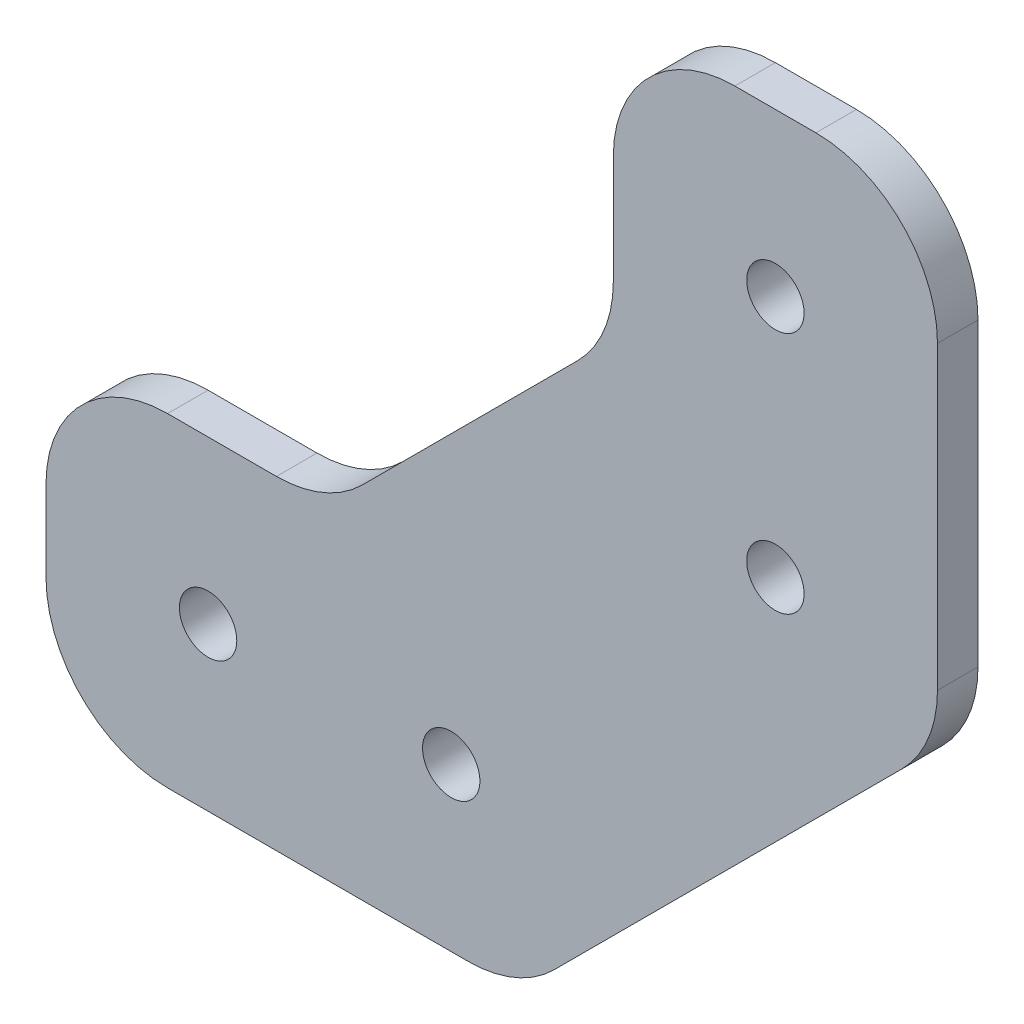
ISO-10303-21;
HEADER;
FILE_DESCRIPTION(('STEP AP214'),'2;1');
FILE_NAME('part.step','',(''),(''),'','','');
FILE_SCHEMA(('AUTOMOTIVE_DESIGN { 1 0 10303 214 1 1 1 1 }'));
ENDSEC;
DATA;
#1=APPLICATION_CONTEXT('core data for automotive mechanical design processes');
#2=APPLICATION_PROTOCOL_DEFINITION('international standard','automotive_design',2000,#1);
#3=PRODUCT_CONTEXT('',#1,'mechanical');
#4=PRODUCT('Part','Part','',(#3));
#5=PRODUCT_RELATED_PRODUCT_CATEGORY('part','',(#4));
#6=PRODUCT_DEFINITION_FORMATION('','',#4);
#7=PRODUCT_DEFINITION_CONTEXT('part definition',#1,'design');
#8=PRODUCT_DEFINITION('design','',#6,#7);
#9=PRODUCT_DEFINITION_SHAPE('','',#8);
#10=(LENGTH_UNIT() NAMED_UNIT(*) SI_UNIT(.MILLI.,.METRE.));
#11=(NAMED_UNIT(*) PLANE_ANGLE_UNIT() SI_UNIT($,.RADIAN.));
#12=(NAMED_UNIT(*) SI_UNIT($,.STERADIAN.) SOLID_ANGLE_UNIT());
#13=UNCERTAINTY_MEASURE_WITH_UNIT(LENGTH_MEASURE(1.E-05),#10,'distance_accuracy_value','');
#14=(GEOMETRIC_REPRESENTATION_CONTEXT(3) GLOBAL_UNCERTAINTY_ASSIGNED_CONTEXT((#13)) GLOBAL_UNIT_ASSIGNED_CONTEXT((#10,
#11,#12)) REPRESENTATION_CONTEXT('',''));
#15=CARTESIAN_POINT('',(0.,0.,0.));
#16=DIRECTION('',(0.,0.,1.));
#17=DIRECTION('',(1.,0.,0.));
#18=AXIS2_PLACEMENT_3D('',#15,#16,#17);
#19=CARTESIAN_POINT('',(69.85,32.8394877578617,1.5875));
#20=DIRECTION('',(-1.,0.,0.));
#21=DIRECTION('',(0.,0.,1.));
#22=AXIS2_PLACEMENT_3D('',#19,#20,#21);
#23=PLANE('',#22);
#24=DIRECTION('',(0.,1.,0.));
#25=VECTOR('',#24,1.);
#26=CARTESIAN_POINT('',(69.85,32.8394877578617,1.5875));
#27=LINE('',#26,#25);
#28=CARTESIAN_POINT('',(69.85,36.7848719394654,1.5875));
#29=VERTEX_POINT('',#28);
#30=CARTESIAN_POINT('',(69.85,60.325,1.5875));
#31=VERTEX_POINT('',#30);
#32=EDGE_CURVE('E166',#29,#31,#27,.T.);
#33=ORIENTED_EDGE('',*,*,#32,.F.);
#34=DIRECTION('',(0.,0.,-1.));
#35=VECTOR('',#34,1.);
#36=CARTESIAN_POINT('',(69.85,36.7848719394654,1.5875));
#37=LINE('',#36,#35);
#38=CARTESIAN_POINT('',(69.85,36.7848719394654,-1.5875));
#39=VERTEX_POINT('',#38);
#40=EDGE_CURVE('E151',#29,#39,#37,.T.);
#41=ORIENTED_EDGE('',*,*,#40,.T.);
#42=DIRECTION('',(0.,1.,0.));
#43=VECTOR('',#42,1.);
#44=CARTESIAN_POINT('',(69.85,32.8394877578617,-1.5875));
#45=LINE('',#44,#43);
#46=CARTESIAN_POINT('',(69.85,60.325,-1.5875));
#47=VERTEX_POINT('',#46);
#48=EDGE_CURVE('E163',#39,#47,#45,.T.);
#49=ORIENTED_EDGE('',*,*,#48,.T.);
#50=DIRECTION('',(0.,0.,-1.));
#51=VECTOR('',#50,1.);
#52=CARTESIAN_POINT('',(69.85,60.325,1.5875));
#53=LINE('',#52,#51);
#54=EDGE_CURVE('E168',#47,#31,#53,.F.);
#55=ORIENTED_EDGE('',*,*,#54,.T.);
#56=EDGE_LOOP('',(#33,#41,#49,#55));
#57=FACE_BOUND('',#56,.T.);
#58=ADVANCED_FACE('F33',(#57),#23,.F.);
#59=CARTESIAN_POINT('',(69.85,69.85,1.5875));
#60=DIRECTION('',(0.,-1.,0.));
#61=DIRECTION('',(0.,0.,-1.));
#62=AXIS2_PLACEMENT_3D('',#59,#60,#61);
#63=PLANE('',#62);
#64=DIRECTION('',(-1.,0.,0.));
#65=VECTOR('',#64,1.);
#66=CARTESIAN_POINT('',(69.85,69.85,1.5875));
#67=LINE('',#66,#65);
#68=CARTESIAN_POINT('',(60.325,69.85,1.5875));
#69=VERTEX_POINT('',#68);
#70=CARTESIAN_POINT('',(53.975,69.85,1.5875));
#71=VERTEX_POINT('',#70);
#72=EDGE_CURVE('E350',#69,#71,#67,.T.);
#73=ORIENTED_EDGE('',*,*,#72,.F.);
#74=DIRECTION('',(0.,0.,-1.));
#75=VECTOR('',#74,1.);
#76=CARTESIAN_POINT('',(60.325,69.85,1.5875));
#77=LINE('',#76,#75);
#78=CARTESIAN_POINT('',(60.325,69.85,-1.5875));
#79=VERTEX_POINT('',#78);
#80=EDGE_CURVE('E234',#69,#79,#77,.T.);
#81=ORIENTED_EDGE('',*,*,#80,.T.);
#82=DIRECTION('',(-1.,0.,0.));
#83=VECTOR('',#82,1.);
#84=CARTESIAN_POINT('',(69.85,69.85,-1.5875));
#85=LINE('',#84,#83);
#86=CARTESIAN_POINT('',(53.975,69.85,-1.5875));
#87=VERTEX_POINT('',#86);
#88=EDGE_CURVE('E173',#79,#87,#85,.T.);
#89=ORIENTED_EDGE('',*,*,#88,.T.);
#90=DIRECTION('',(0.,0.,-1.));
#91=VECTOR('',#90,1.);
#92=CARTESIAN_POINT('',(53.975,69.85,1.5875));
#93=LINE('',#92,#91);
#94=EDGE_CURVE('E232',#87,#71,#93,.F.);
#95=ORIENTED_EDGE('',*,*,#94,.T.);
#96=EDGE_LOOP('',(#73,#81,#89,#95));
#97=FACE_BOUND('',#96,.T.);
#98=ADVANCED_FACE('F314',(#97),#63,.F.);
#99=CARTESIAN_POINT('',(44.45,69.85,1.5875));
#100=DIRECTION('',(1.,0.,0.));
#101=DIRECTION('',(0.,1.,0.));
#102=AXIS2_PLACEMENT_3D('',#99,#100,#101);
#103=PLANE('',#102);
#104=DIRECTION('',(0.,-1.,0.));
#105=VECTOR('',#104,1.);
#106=CARTESIAN_POINT('',(44.45,69.85,1.5875));
#107=LINE('',#106,#105);
#108=CARTESIAN_POINT('',(44.45,60.325,1.5875));
#109=VERTEX_POINT('',#108);
#110=CARTESIAN_POINT('',(44.45,51.7960244842766,1.5875));
#111=VERTEX_POINT('',#110);
#112=EDGE_CURVE('E281',#109,#111,#107,.T.);
#113=ORIENTED_EDGE('',*,*,#112,.F.);
#114=DIRECTION('',(0.,0.,-1.));
#115=VECTOR('',#114,1.);
#116=CARTESIAN_POINT('',(44.45,60.325,1.5875));
#117=LINE('',#116,#115);
#118=CARTESIAN_POINT('',(44.45,60.325,-1.5875));
#119=VERTEX_POINT('',#118);
#120=EDGE_CURVE('E239',#109,#119,#117,.T.);
#121=ORIENTED_EDGE('',*,*,#120,.T.);
#122=DIRECTION('',(0.,-1.,0.));
#123=VECTOR('',#122,1.);
#124=CARTESIAN_POINT('',(44.45,69.85,-1.5875));
#125=LINE('',#124,#123);
#126=CARTESIAN_POINT('',(44.45,51.7960244842766,-1.5875));
#127=VERTEX_POINT('',#126);
#128=EDGE_CURVE('E177',#119,#127,#125,.T.);
#129=ORIENTED_EDGE('',*,*,#128,.T.);
#130=DIRECTION('',(0.,0.,-1.));
#131=VECTOR('',#130,1.);
#132=CARTESIAN_POINT('',(44.45,51.7960244842766,1.5875));
#133=LINE('',#132,#131);
#134=EDGE_CURVE('E237',#127,#111,#133,.F.);
#135=ORIENTED_EDGE('',*,*,#134,.T.);
#136=EDGE_LOOP('',(#113,#121,#129,#135));
#137=FACE_BOUND('',#136,.T.);
#138=ADVANCED_FACE('F319',(#137),#103,.F.);
#139=CARTESIAN_POINT('',(44.45,47.8506403026729,1.5875));
#140=DIRECTION('',(0.707106781186548,-0.707106781186547,0.));
#141=DIRECTION('',(0.707106781186547,0.707106781186548,0.));
#142=AXIS2_PLACEMENT_3D('',#139,#140,#141);
#143=PLANE('',#142);
#144=DIRECTION('',(-0.707106781186547,-0.707106781186548,0.));
#145=VECTOR('',#144,1.);
#146=CARTESIAN_POINT('',(44.45,47.8506403026729,1.5875));
#147=LINE('',#146,#145);
#148=CARTESIAN_POINT('',(41.6601920908018,45.0608323934748,1.5875));
#149=VERTEX_POINT('',#148);
#150=CARTESIAN_POINT('',(24.7891676065252,28.1898079091981,1.5875));
#151=VERTEX_POINT('',#150);
#152=EDGE_CURVE('E273',#149,#151,#147,.T.);
#153=ORIENTED_EDGE('',*,*,#152,.F.);
#154=DIRECTION('',(0.,0.,-1.));
#155=VECTOR('',#154,1.);
#156=CARTESIAN_POINT('',(41.6601920908018,45.0608323934748,-1.5875));
#157=LINE('',#156,#155);
#158=CARTESIAN_POINT('',(41.6601920908018,45.0608323934748,-1.5875));
#159=VERTEX_POINT('',#158);
#160=EDGE_CURVE('E244',#149,#159,#157,.T.);
#161=ORIENTED_EDGE('',*,*,#160,.T.);
#162=DIRECTION('',(-0.707106781186547,-0.707106781186548,0.));
#163=VECTOR('',#162,1.);
#164=CARTESIAN_POINT('',(44.45,47.8506403026729,-1.5875));
#165=LINE('',#164,#163);
#166=CARTESIAN_POINT('',(24.7891676065252,28.1898079091981,-1.5875));
#167=VERTEX_POINT('',#166);
#168=EDGE_CURVE('E188',#159,#167,#165,.T.);
#169=ORIENTED_EDGE('',*,*,#168,.T.);
#170=DIRECTION('',(0.,0.,-1.));
#171=VECTOR('',#170,1.);
#172=CARTESIAN_POINT('',(24.7891676065252,28.1898079091981,1.5875));
#173=LINE('',#172,#171);
#174=EDGE_CURVE('E242',#167,#151,#173,.F.);
#175=ORIENTED_EDGE('',*,*,#174,.T.);
#176=EDGE_LOOP('',(#153,#161,#169,#175));
#177=FACE_BOUND('',#176,.T.);
#178=ADVANCED_FACE('F262',(#177),#143,.F.);
#179=CARTESIAN_POINT('',(21.9993596973271,25.4,1.5875));
#180=DIRECTION('',(0.,-1.,0.));
#181=DIRECTION('',(0.,0.,-1.));
#182=AXIS2_PLACEMENT_3D('',#179,#180,#181);
#183=PLANE('',#182);
#184=DIRECTION('',(-1.,0.,0.));
#185=VECTOR('',#184,1.);
#186=CARTESIAN_POINT('',(21.9993596973271,25.4,1.5875));
#187=LINE('',#186,#185);
#188=CARTESIAN_POINT('',(18.0539755157234,25.4,1.5875));
#189=VERTEX_POINT('',#188);
#190=CARTESIAN_POINT('',(9.525,25.4,1.5875));
#191=VERTEX_POINT('',#190);
#192=EDGE_CURVE('E271',#189,#191,#187,.T.);
#193=ORIENTED_EDGE('',*,*,#192,.F.);
#194=DIRECTION('',(0.,0.,-1.));
#195=VECTOR('',#194,1.);
#196=CARTESIAN_POINT('',(18.0539755157234,25.4,-1.5875));
#197=LINE('',#196,#195);
#198=CARTESIAN_POINT('',(18.0539755157234,25.4,-1.5875));
#199=VERTEX_POINT('',#198);
#200=EDGE_CURVE('E249',#189,#199,#197,.T.);
#201=ORIENTED_EDGE('',*,*,#200,.T.);
#202=DIRECTION('',(-1.,0.,0.));
#203=VECTOR('',#202,1.);
#204=CARTESIAN_POINT('',(21.9993596973271,25.4,-1.5875));
#205=LINE('',#204,#203);
#206=CARTESIAN_POINT('',(9.525,25.4,-1.5875));
#207=VERTEX_POINT('',#206);
#208=EDGE_CURVE('E191',#199,#207,#205,.T.);
#209=ORIENTED_EDGE('',*,*,#208,.T.);
#210=DIRECTION('',(0.,0.,-1.));
#211=VECTOR('',#210,1.);
#212=CARTESIAN_POINT('',(9.525,25.4,1.5875));
#213=LINE('',#212,#211);
#214=EDGE_CURVE('E247',#207,#191,#213,.F.);
#215=ORIENTED_EDGE('',*,*,#214,.T.);
#216=EDGE_LOOP('',(#193,#201,#209,#215));
#217=FACE_BOUND('',#216,.T.);
#218=ADVANCED_FACE('F275',(#217),#183,.F.);
#219=CARTESIAN_POINT('',(0.,25.4,1.5875));
#220=DIRECTION('',(1.,0.,0.));
#221=DIRECTION('',(0.,1.,0.));
#222=AXIS2_PLACEMENT_3D('',#219,#220,#221);
#223=PLANE('',#222);
#224=DIRECTION('',(0.,-1.,0.));
#225=VECTOR('',#224,1.);
#226=CARTESIAN_POINT('',(0.,25.4,-1.5875));
#227=LINE('',#226,#225);
#228=CARTESIAN_POINT('',(0.,15.875,-1.5875));
#229=VERTEX_POINT('',#228);
#230=CARTESIAN_POINT('',(0.,9.525,-1.5875));
#231=VERTEX_POINT('',#230);
#232=EDGE_CURVE('E194',#229,#231,#227,.T.);
#233=ORIENTED_EDGE('',*,*,#232,.T.);
#234=DIRECTION('',(0.,0.,-1.));
#235=VECTOR('',#234,1.);
#236=CARTESIAN_POINT('',(0.,9.525,1.5875));
#237=LINE('',#236,#235);
#238=CARTESIAN_POINT('',(0.,9.525,1.5875));
#239=VERTEX_POINT('',#238);
#240=EDGE_CURVE('E230',#231,#239,#237,.F.);
#241=ORIENTED_EDGE('',*,*,#240,.T.);
#242=DIRECTION('',(0.,-1.,0.));
#243=VECTOR('',#242,1.);
#244=CARTESIAN_POINT('',(0.,25.4,1.5875));
#245=LINE('',#244,#243);
#246=CARTESIAN_POINT('',(0.,15.875,1.5875));
#247=VERTEX_POINT('',#246);
#248=EDGE_CURVE('E277',#247,#239,#245,.T.);
#249=ORIENTED_EDGE('',*,*,#248,.F.);
#250=DIRECTION('',(0.,0.,-1.));
#251=VECTOR('',#250,1.);
#252=CARTESIAN_POINT('',(0.,15.875,1.5875));
#253=LINE('',#252,#251);
#254=EDGE_CURVE('E227',#247,#229,#253,.T.);
#255=ORIENTED_EDGE('',*,*,#254,.T.);
#256=EDGE_LOOP('',(#233,#241,#249,#255));
#257=FACE_BOUND('',#256,.T.);
#258=ADVANCED_FACE('F299',(#257),#223,.F.);
#259=CARTESIAN_POINT('',(0.,0.,1.5875));
#260=DIRECTION('',(0.,1.,0.));
#261=DIRECTION('',(-1.,0.,0.));
#262=AXIS2_PLACEMENT_3D('',#259,#260,#261);
#263=PLANE('',#262);
#264=DIRECTION('',(1.,0.,0.));
#265=VECTOR('',#264,1.);
#266=CARTESIAN_POINT('',(0.,0.,-1.5875));
#267=LINE('',#266,#265);
#268=CARTESIAN_POINT('',(9.525,0.,-1.5875));
#269=VERTEX_POINT('',#268);
#270=CARTESIAN_POINT('',(33.0651280605346,0.,-1.5875));
#271=VERTEX_POINT('',#270);
#272=EDGE_CURVE('E197',#269,#271,#267,.T.);
#273=ORIENTED_EDGE('',*,*,#272,.T.);
#274=DIRECTION('',(0.,0.,-1.));
#275=VECTOR('',#274,1.);
#276=CARTESIAN_POINT('',(33.0651280605346,0.,1.5875));
#277=LINE('',#276,#275);
#278=CARTESIAN_POINT('',(33.0651280605346,0.,1.5875));
#279=VERTEX_POINT('',#278);
#280=EDGE_CURVE('E48',#271,#279,#277,.F.);
#281=ORIENTED_EDGE('',*,*,#280,.T.);
#282=DIRECTION('',(1.,0.,0.));
#283=VECTOR('',#282,1.);
#284=CARTESIAN_POINT('',(0.,0.,1.5875));
#285=LINE('',#284,#283);
#286=CARTESIAN_POINT('',(9.525,0.,1.5875));
#287=VERTEX_POINT('',#286);
#288=EDGE_CURVE('E279',#287,#279,#285,.T.);
#289=ORIENTED_EDGE('',*,*,#288,.F.);
#290=DIRECTION('',(0.,0.,-1.));
#291=VECTOR('',#290,1.);
#292=CARTESIAN_POINT('',(9.525,0.,1.5875));
#293=LINE('',#292,#291);
#294=EDGE_CURVE('E223',#287,#269,#293,.T.);
#295=ORIENTED_EDGE('',*,*,#294,.T.);
#296=EDGE_LOOP('',(#273,#281,#289,#295));
#297=FACE_BOUND('',#296,.T.);
#298=ADVANCED_FACE('F292',(#297),#263,.F.);
#299=CARTESIAN_POINT('',(37.0105122421383,0.,1.5875));
#300=DIRECTION('',(-0.707106781186548,0.707106781186548,0.));
#301=DIRECTION('',(-0.707106781186548,-0.707106781186548,0.));
#302=AXIS2_PLACEMENT_3D('',#299,#300,#301);
#303=PLANE('',#302);
#304=DIRECTION('',(0.707106781186547,0.707106781186547,0.));
#305=VECTOR('',#304,1.);
#306=CARTESIAN_POINT('',(37.0105122421383,0.,-1.5875));
#307=LINE('',#306,#305);
#308=CARTESIAN_POINT('',(39.8003201513365,2.78980790919814,-1.5875));
#309=VERTEX_POINT('',#308);
#310=CARTESIAN_POINT('',(67.0601920908019,30.0496798486636,-1.5875));
#311=VERTEX_POINT('',#310);
#312=EDGE_CURVE('E199',#309,#311,#307,.T.);
#313=ORIENTED_EDGE('',*,*,#312,.T.);
#314=DIRECTION('',(0.,0.,-1.));
#315=VECTOR('',#314,1.);
#316=CARTESIAN_POINT('',(67.0601920908019,30.0496798486636,1.5875));
#317=LINE('',#316,#315);
#318=CARTESIAN_POINT('',(67.0601920908019,30.0496798486636,1.5875));
#319=VERTEX_POINT('',#318);
#320=EDGE_CURVE('E152',#311,#319,#317,.F.);
#321=ORIENTED_EDGE('',*,*,#320,.T.);
#322=DIRECTION('',(0.707106781186547,0.707106781186547,0.));
#323=VECTOR('',#322,1.);
#324=CARTESIAN_POINT('',(37.0105122421383,0.,1.5875));
#325=LINE('',#324,#323);
#326=CARTESIAN_POINT('',(39.8003201513365,2.78980790919814,1.5875));
#327=VERTEX_POINT('',#326);
#328=EDGE_CURVE('E183',#327,#319,#325,.T.);
#329=ORIENTED_EDGE('',*,*,#328,.F.);
#330=DIRECTION('',(0.,0.,-1.));
#331=VECTOR('',#330,1.);
#332=CARTESIAN_POINT('',(39.8003201513365,2.78980790919814,1.5875));
#333=LINE('',#332,#331);
#334=EDGE_CURVE('E157',#327,#309,#333,.T.);
#335=ORIENTED_EDGE('',*,*,#334,.T.);
#336=EDGE_LOOP('',(#313,#321,#329,#335));
#337=FACE_BOUND('',#336,.T.);
#338=ADVANCED_FACE('F288',(#337),#303,.F.);
#339=CARTESIAN_POINT('',(0.,0.,1.5875));
#340=DIRECTION('',(0.,0.,1.));
#341=DIRECTION('',(1.,0.,0.));
#342=AXIS2_PLACEMENT_3D('',#339,#340,#341);
#343=PLANE('',#342);
#344=CARTESIAN_POINT('',(12.7,12.7,1.5875));
#345=DIRECTION('',(0.,0.,1.));
#346=DIRECTION('',(1.,0.,0.));
#347=AXIS2_PLACEMENT_3D('',#344,#345,#346);
#348=CIRCLE('',#347,2.24789999999999);
#349=CARTESIAN_POINT('',(14.9479,12.7,1.5875));
#350=VERTEX_POINT('',#349);
#351=EDGE_CURVE('E371',#350,#350,#348,.T.);
#352=ORIENTED_EDGE('',*,*,#351,.F.);
#353=EDGE_LOOP('',(#352));
#354=FACE_BOUND('',#353,.T.);
#355=CARTESIAN_POINT('',(31.75,12.7,1.5875));
#356=DIRECTION('',(0.,0.,1.));
#357=DIRECTION('',(1.,0.,0.));
#358=AXIS2_PLACEMENT_3D('',#355,#356,#357);
#359=CIRCLE('',#358,2.24789999999999);
#360=CARTESIAN_POINT('',(33.9979,12.7,1.5875));
#361=VERTEX_POINT('',#360);
#362=EDGE_CURVE('E365',#361,#361,#359,.T.);
#363=ORIENTED_EDGE('',*,*,#362,.F.);
#364=EDGE_LOOP('',(#363));
#365=FACE_BOUND('',#364,.T.);
#366=CARTESIAN_POINT('',(57.15,38.1,1.5875));
#367=DIRECTION('',(0.,0.,1.));
#368=DIRECTION('',(1.,0.,0.));
#369=AXIS2_PLACEMENT_3D('',#366,#367,#368);
#370=CIRCLE('',#369,2.24789999999998);
#371=CARTESIAN_POINT('',(59.3979,38.1,1.5875));
#372=VERTEX_POINT('',#371);
#373=EDGE_CURVE('E359',#372,#372,#370,.T.);
#374=ORIENTED_EDGE('',*,*,#373,.F.);
#375=EDGE_LOOP('',(#374));
#376=FACE_BOUND('',#375,.T.);
#377=CARTESIAN_POINT('',(57.15,57.15,1.5875));
#378=DIRECTION('',(0.,0.,1.));
#379=DIRECTION('',(1.,0.,0.));
#380=AXIS2_PLACEMENT_3D('',#377,#378,#379);
#381=CIRCLE('',#380,2.24789999999998);
#382=CARTESIAN_POINT('',(59.3979,57.15,1.5875));
#383=VERTEX_POINT('',#382);
#384=EDGE_CURVE('E180',#383,#383,#381,.T.);
#385=ORIENTED_EDGE('',*,*,#384,.F.);
#386=EDGE_LOOP('',(#385));
#387=FACE_BOUND('',#386,.T.);
#388=ORIENTED_EDGE('',*,*,#328,.T.);
#389=CARTESIAN_POINT('',(60.325,36.7848719394654,1.5875));
#390=DIRECTION('',(0.,0.,1.));
#391=DIRECTION('',(1.,0.,0.));
#392=AXIS2_PLACEMENT_3D('',#389,#390,#391);
#393=CIRCLE('',#392,9.525);
#394=EDGE_CURVE('E221',#319,#29,#393,.T.);
#395=ORIENTED_EDGE('',*,*,#394,.T.);
#396=ORIENTED_EDGE('',*,*,#32,.T.);
#397=CARTESIAN_POINT('',(60.325,60.325,1.5875));
#398=DIRECTION('',(0.,0.,1.));
#399=DIRECTION('',(1.,0.,0.));
#400=AXIS2_PLACEMENT_3D('',#397,#398,#399);
#401=CIRCLE('',#400,9.525);
#402=EDGE_CURVE('E216',#31,#69,#401,.T.);
#403=ORIENTED_EDGE('',*,*,#402,.T.);
#404=ORIENTED_EDGE('',*,*,#72,.T.);
#405=CARTESIAN_POINT('',(53.975,60.325,1.5875));
#406=DIRECTION('',(0.,0.,1.));
#407=DIRECTION('',(1.,0.,0.));
#408=AXIS2_PLACEMENT_3D('',#405,#406,#407);
#409=CIRCLE('',#408,9.525);
#410=EDGE_CURVE('E214',#71,#109,#409,.T.);
#411=ORIENTED_EDGE('',*,*,#410,.T.);
#412=ORIENTED_EDGE('',*,*,#112,.T.);
#413=CARTESIAN_POINT('',(34.925,51.7960244842766,1.5875));
#414=DIRECTION('',(0.,0.,1.));
#415=DIRECTION('',(1.,0.,0.));
#416=AXIS2_PLACEMENT_3D('',#413,#414,#415);
#417=CIRCLE('',#416,9.525);
#418=EDGE_CURVE('E254',#111,#149,#417,.F.);
#419=ORIENTED_EDGE('',*,*,#418,.T.);
#420=ORIENTED_EDGE('',*,*,#152,.T.);
#421=CARTESIAN_POINT('',(18.0539755157234,34.925,1.5875));
#422=DIRECTION('',(0.,0.,1.));
#423=DIRECTION('',(1.,0.,0.));
#424=AXIS2_PLACEMENT_3D('',#421,#422,#423);
#425=CIRCLE('',#424,9.525);
#426=EDGE_CURVE('E11',#151,#189,#425,.F.);
#427=ORIENTED_EDGE('',*,*,#426,.T.);
#428=ORIENTED_EDGE('',*,*,#192,.T.);
#429=CARTESIAN_POINT('',(9.525,15.875,1.5875));
#430=DIRECTION('',(0.,0.,1.));
#431=DIRECTION('',(1.,0.,0.));
#432=AXIS2_PLACEMENT_3D('',#429,#430,#431);
#433=CIRCLE('',#432,9.525);
#434=EDGE_CURVE('E212',#191,#247,#433,.T.);
#435=ORIENTED_EDGE('',*,*,#434,.T.);
#436=ORIENTED_EDGE('',*,*,#248,.T.);
#437=CARTESIAN_POINT('',(9.525,9.525,1.5875));
#438=DIRECTION('',(0.,0.,1.));
#439=DIRECTION('',(1.,0.,0.));
#440=AXIS2_PLACEMENT_3D('',#437,#438,#439);
#441=CIRCLE('',#440,9.525);
#442=EDGE_CURVE('E55',#239,#287,#441,.T.);
#443=ORIENTED_EDGE('',*,*,#442,.T.);
#444=ORIENTED_EDGE('',*,*,#288,.T.);
#445=CARTESIAN_POINT('',(33.0651280605346,9.52500000000001,1.5875));
#446=DIRECTION('',(0.,0.,1.));
#447=DIRECTION('',(1.,0.,0.));
#448=AXIS2_PLACEMENT_3D('',#445,#446,#447);
#449=CIRCLE('',#448,9.525);
#450=EDGE_CURVE('E219',#279,#327,#449,.T.);
#451=ORIENTED_EDGE('',*,*,#450,.T.);
#452=EDGE_LOOP('',(#388,#395,#396,#403,#404,#411,#412,#419,#420,#427,#428,#435,#436,#443,#444,#451));
#453=FACE_BOUND('',#452,.T.);
#454=ADVANCED_FACE('F270',(#354,#365,#376,#387,#453),#343,.T.);
#455=CARTESIAN_POINT('',(0.,0.,-1.5875));
#456=DIRECTION('',(0.,0.,1.));
#457=DIRECTION('',(1.,0.,0.));
#458=AXIS2_PLACEMENT_3D('',#455,#456,#457);
#459=PLANE('',#458);
#460=CARTESIAN_POINT('',(12.7,12.7,-1.5875));
#461=DIRECTION('',(0.,0.,1.));
#462=DIRECTION('',(1.,0.,0.));
#463=AXIS2_PLACEMENT_3D('',#460,#461,#462);
#464=CIRCLE('',#463,2.2479);
#465=CARTESIAN_POINT('',(14.9479,12.7,-1.5875));
#466=VERTEX_POINT('',#465);
#467=EDGE_CURVE('E368',#466,#466,#464,.T.);
#468=ORIENTED_EDGE('',*,*,#467,.T.);
#469=EDGE_LOOP('',(#468));
#470=FACE_BOUND('',#469,.T.);
#471=CARTESIAN_POINT('',(31.75,12.7,-1.5875));
#472=DIRECTION('',(0.,0.,1.));
#473=DIRECTION('',(1.,0.,0.));
#474=AXIS2_PLACEMENT_3D('',#471,#472,#473);
#475=CIRCLE('',#474,2.2479);
#476=CARTESIAN_POINT('',(33.9979,12.7,-1.5875));
#477=VERTEX_POINT('',#476);
#478=EDGE_CURVE('E362',#477,#477,#475,.T.);
#479=ORIENTED_EDGE('',*,*,#478,.T.);
#480=EDGE_LOOP('',(#479));
#481=FACE_BOUND('',#480,.T.);
#482=CARTESIAN_POINT('',(57.15,38.1,-1.5875));
#483=DIRECTION('',(0.,0.,1.));
#484=DIRECTION('',(1.,0.,0.));
#485=AXIS2_PLACEMENT_3D('',#482,#483,#484);
#486=CIRCLE('',#485,2.2479);
#487=CARTESIAN_POINT('',(59.3979,38.1,-1.5875));
#488=VERTEX_POINT('',#487);
#489=EDGE_CURVE('E356',#488,#488,#486,.T.);
#490=ORIENTED_EDGE('',*,*,#489,.T.);
#491=EDGE_LOOP('',(#490));
#492=FACE_BOUND('',#491,.T.);
#493=CARTESIAN_POINT('',(57.15,57.15,-1.5875));
#494=DIRECTION('',(0.,0.,1.));
#495=DIRECTION('',(1.,0.,0.));
#496=AXIS2_PLACEMENT_3D('',#493,#494,#495);
#497=CIRCLE('',#496,2.2479);
#498=CARTESIAN_POINT('',(59.3979,57.15,-1.5875));
#499=VERTEX_POINT('',#498);
#500=EDGE_CURVE('E174',#499,#499,#497,.T.);
#501=ORIENTED_EDGE('',*,*,#500,.T.);
#502=EDGE_LOOP('',(#501));
#503=FACE_BOUND('',#502,.T.);
#504=ORIENTED_EDGE('',*,*,#48,.F.);
#505=CARTESIAN_POINT('',(60.325,36.7848719394654,-1.5875));
#506=DIRECTION('',(0.,0.,1.));
#507=DIRECTION('',(1.,0.,0.));
#508=AXIS2_PLACEMENT_3D('',#505,#506,#507);
#509=CIRCLE('',#508,9.525);
#510=EDGE_CURVE('E147',#39,#311,#509,.F.);
#511=ORIENTED_EDGE('',*,*,#510,.T.);
#512=ORIENTED_EDGE('',*,*,#312,.F.);
#513=CARTESIAN_POINT('',(33.0651280605346,9.52500000000001,-1.5875));
#514=DIRECTION('',(0.,0.,1.));
#515=DIRECTION('',(1.,0.,0.));
#516=AXIS2_PLACEMENT_3D('',#513,#514,#515);
#517=CIRCLE('',#516,9.525);
#518=EDGE_CURVE('E158',#309,#271,#517,.F.);
#519=ORIENTED_EDGE('',*,*,#518,.T.);
#520=ORIENTED_EDGE('',*,*,#272,.F.);
#521=CARTESIAN_POINT('',(9.525,9.525,-1.5875));
#522=DIRECTION('',(0.,0.,1.));
#523=DIRECTION('',(1.,0.,0.));
#524=AXIS2_PLACEMENT_3D('',#521,#522,#523);
#525=CIRCLE('',#524,9.525);
#526=EDGE_CURVE('E206',#269,#231,#525,.F.);
#527=ORIENTED_EDGE('',*,*,#526,.T.);
#528=ORIENTED_EDGE('',*,*,#232,.F.);
#529=CARTESIAN_POINT('',(9.525,15.875,-1.5875));
#530=DIRECTION('',(0.,0.,1.));
#531=DIRECTION('',(1.,0.,0.));
#532=AXIS2_PLACEMENT_3D('',#529,#530,#531);
#533=CIRCLE('',#532,9.525);
#534=EDGE_CURVE('E167',#229,#207,#533,.F.);
#535=ORIENTED_EDGE('',*,*,#534,.T.);
#536=ORIENTED_EDGE('',*,*,#208,.F.);
#537=CARTESIAN_POINT('',(18.0539755157234,34.925,-1.5875));
#538=DIRECTION('',(0.,0.,1.));
#539=DIRECTION('',(1.,0.,0.));
#540=AXIS2_PLACEMENT_3D('',#537,#538,#539);
#541=CIRCLE('',#540,9.525);
#542=EDGE_CURVE('E41',#199,#167,#541,.T.);
#543=ORIENTED_EDGE('',*,*,#542,.T.);
#544=ORIENTED_EDGE('',*,*,#168,.F.);
#545=CARTESIAN_POINT('',(34.925,51.7960244842766,-1.5875));
#546=DIRECTION('',(0.,0.,1.));
#547=DIRECTION('',(1.,0.,0.));
#548=AXIS2_PLACEMENT_3D('',#545,#546,#547);
#549=CIRCLE('',#548,9.525);
#550=EDGE_CURVE('E252',#159,#127,#549,.T.);
#551=ORIENTED_EDGE('',*,*,#550,.T.);
#552=ORIENTED_EDGE('',*,*,#128,.F.);
#553=CARTESIAN_POINT('',(53.975,60.325,-1.5875));
#554=DIRECTION('',(0.,0.,1.));
#555=DIRECTION('',(1.,0.,0.));
#556=AXIS2_PLACEMENT_3D('',#553,#554,#555);
#557=CIRCLE('',#556,9.525);
#558=EDGE_CURVE('E203',#119,#87,#557,.F.);
#559=ORIENTED_EDGE('',*,*,#558,.T.);
#560=ORIENTED_EDGE('',*,*,#88,.F.);
#561=CARTESIAN_POINT('',(60.325,60.325,-1.5875));
#562=DIRECTION('',(0.,0.,1.));
#563=DIRECTION('',(1.,0.,0.));
#564=AXIS2_PLACEMENT_3D('',#561,#562,#563);
#565=CIRCLE('',#564,9.525);
#566=EDGE_CURVE('E172',#79,#47,#565,.F.);
#567=ORIENTED_EDGE('',*,*,#566,.T.);
#568=EDGE_LOOP('',(#504,#511,#512,#519,#520,#527,#528,#535,#536,#543,#544,#551,#552,#559,#560,#567));
#569=FACE_BOUND('',#568,.T.);
#570=ADVANCED_FACE('F170',(#470,#481,#492,#503,#569),#459,.F.);
#571=CARTESIAN_POINT('',(60.325,36.7848719394654,1.5875));
#572=DIRECTION('',(0.,0.,-1.));
#573=DIRECTION('',(-1.,0.,0.));
#574=AXIS2_PLACEMENT_3D('',#571,#572,#573);
#575=CYLINDRICAL_SURFACE('',#574,9.525);
#576=ORIENTED_EDGE('',*,*,#394,.F.);
#577=ORIENTED_EDGE('',*,*,#320,.F.);
#578=ORIENTED_EDGE('',*,*,#510,.F.);
#579=ORIENTED_EDGE('',*,*,#40,.F.);
#580=EDGE_LOOP('',(#576,#577,#578,#579));
#581=FACE_BOUND('',#580,.T.);
#582=ADVANCED_FACE('F150',(#581),#575,.T.);
#583=CARTESIAN_POINT('',(33.0651280605346,9.52500000000001,1.5875));
#584=DIRECTION('',(0.,0.,-1.));
#585=DIRECTION('',(-1.,0.,0.));
#586=AXIS2_PLACEMENT_3D('',#583,#584,#585);
#587=CYLINDRICAL_SURFACE('',#586,9.525);
#588=ORIENTED_EDGE('',*,*,#450,.F.);
#589=ORIENTED_EDGE('',*,*,#280,.F.);
#590=ORIENTED_EDGE('',*,*,#518,.F.);
#591=ORIENTED_EDGE('',*,*,#334,.F.);
#592=EDGE_LOOP('',(#588,#589,#590,#591));
#593=FACE_BOUND('',#592,.T.);
#594=ADVANCED_FACE('F290',(#593),#587,.T.);
#595=CARTESIAN_POINT('',(9.525,9.525,1.5875));
#596=DIRECTION('',(0.,0.,-1.));
#597=DIRECTION('',(-1.,0.,0.));
#598=AXIS2_PLACEMENT_3D('',#595,#596,#597);
#599=CYLINDRICAL_SURFACE('',#598,9.525);
#600=ORIENTED_EDGE('',*,*,#442,.F.);
#601=ORIENTED_EDGE('',*,*,#240,.F.);
#602=ORIENTED_EDGE('',*,*,#526,.F.);
#603=ORIENTED_EDGE('',*,*,#294,.F.);
#604=EDGE_LOOP('',(#600,#601,#602,#603));
#605=FACE_BOUND('',#604,.T.);
#606=ADVANCED_FACE('F295',(#605),#599,.T.);
#607=CARTESIAN_POINT('',(60.325,60.325,1.5875));
#608=DIRECTION('',(0.,0.,-1.));
#609=DIRECTION('',(-1.,0.,0.));
#610=AXIS2_PLACEMENT_3D('',#607,#608,#609);
#611=CYLINDRICAL_SURFACE('',#610,9.525);
#612=ORIENTED_EDGE('',*,*,#402,.F.);
#613=ORIENTED_EDGE('',*,*,#54,.F.);
#614=ORIENTED_EDGE('',*,*,#566,.F.);
#615=ORIENTED_EDGE('',*,*,#80,.F.);
#616=EDGE_LOOP('',(#612,#613,#614,#615));
#617=FACE_BOUND('',#616,.T.);
#618=ADVANCED_FACE('F330',(#617),#611,.T.);
#619=CARTESIAN_POINT('',(53.975,60.325,1.5875));
#620=DIRECTION('',(0.,0.,-1.));
#621=DIRECTION('',(-1.,0.,0.));
#622=AXIS2_PLACEMENT_3D('',#619,#620,#621);
#623=CYLINDRICAL_SURFACE('',#622,9.525);
#624=ORIENTED_EDGE('',*,*,#410,.F.);
#625=ORIENTED_EDGE('',*,*,#94,.F.);
#626=ORIENTED_EDGE('',*,*,#558,.F.);
#627=ORIENTED_EDGE('',*,*,#120,.F.);
#628=EDGE_LOOP('',(#624,#625,#626,#627));
#629=FACE_BOUND('',#628,.T.);
#630=ADVANCED_FACE('F333',(#629),#623,.T.);
#631=CARTESIAN_POINT('',(34.925,51.7960244842766,1.5875));
#632=DIRECTION('',(0.,0.,1.));
#633=DIRECTION('',(1.,0.,0.));
#634=AXIS2_PLACEMENT_3D('',#631,#632,#633);
#635=CYLINDRICAL_SURFACE('',#634,9.525);
#636=ORIENTED_EDGE('',*,*,#418,.F.);
#637=ORIENTED_EDGE('',*,*,#134,.F.);
#638=ORIENTED_EDGE('',*,*,#550,.F.);
#639=ORIENTED_EDGE('',*,*,#160,.F.);
#640=EDGE_LOOP('',(#636,#637,#638,#639));
#641=FACE_BOUND('',#640,.T.);
#642=ADVANCED_FACE('F312',(#641),#635,.F.);
#643=CARTESIAN_POINT('',(18.0539755157234,34.925,1.5875));
#644=DIRECTION('',(0.,0.,1.));
#645=DIRECTION('',(1.,0.,0.));
#646=AXIS2_PLACEMENT_3D('',#643,#644,#645);
#647=CYLINDRICAL_SURFACE('',#646,9.525);
#648=ORIENTED_EDGE('',*,*,#426,.F.);
#649=ORIENTED_EDGE('',*,*,#174,.F.);
#650=ORIENTED_EDGE('',*,*,#542,.F.);
#651=ORIENTED_EDGE('',*,*,#200,.F.);
#652=EDGE_LOOP('',(#648,#649,#650,#651));
#653=FACE_BOUND('',#652,.T.);
#654=ADVANCED_FACE('F266',(#653),#647,.F.);
#655=CARTESIAN_POINT('',(9.525,15.875,1.5875));
#656=DIRECTION('',(0.,0.,-1.));
#657=DIRECTION('',(-1.,0.,0.));
#658=AXIS2_PLACEMENT_3D('',#655,#656,#657);
#659=CYLINDRICAL_SURFACE('',#658,9.525);
#660=ORIENTED_EDGE('',*,*,#434,.F.);
#661=ORIENTED_EDGE('',*,*,#214,.F.);
#662=ORIENTED_EDGE('',*,*,#534,.F.);
#663=ORIENTED_EDGE('',*,*,#254,.F.);
#664=EDGE_LOOP('',(#660,#661,#662,#663));
#665=FACE_BOUND('',#664,.T.);
#666=ADVANCED_FACE('F35',(#665),#659,.T.);
#667=CARTESIAN_POINT('',(57.15,57.15,1.5875));
#668=DIRECTION('',(0.,0.,1.));
#669=DIRECTION('',(1.,0.,0.));
#670=AXIS2_PLACEMENT_3D('',#667,#668,#669);
#671=CYLINDRICAL_SURFACE('',#670,2.24789999999999);
#672=ORIENTED_EDGE('',*,*,#500,.F.);
#673=EDGE_LOOP('',(#672));
#674=FACE_BOUND('',#673,.T.);
#675=ORIENTED_EDGE('',*,*,#384,.T.);
#676=EDGE_LOOP('',(#675));
#677=FACE_BOUND('',#676,.T.);
#678=ADVANCED_FACE('F304',(#674,#677),#671,.F.);
#679=CARTESIAN_POINT('',(57.15,38.1,1.5875));
#680=DIRECTION('',(0.,0.,1.));
#681=DIRECTION('',(1.,0.,0.));
#682=AXIS2_PLACEMENT_3D('',#679,#680,#681);
#683=CYLINDRICAL_SURFACE('',#682,2.24789999999999);
#684=ORIENTED_EDGE('',*,*,#489,.F.);
#685=EDGE_LOOP('',(#684));
#686=FACE_BOUND('',#685,.T.);
#687=ORIENTED_EDGE('',*,*,#373,.T.);
#688=EDGE_LOOP('',(#687));
#689=FACE_BOUND('',#688,.T.);
#690=ADVANCED_FACE('F309',(#686,#689),#683,.F.);
#691=CARTESIAN_POINT('',(31.75,12.7,1.5875));
#692=DIRECTION('',(0.,0.,1.));
#693=DIRECTION('',(1.,0.,0.));
#694=AXIS2_PLACEMENT_3D('',#691,#692,#693);
#695=CYLINDRICAL_SURFACE('',#694,2.24789999999999);
#696=ORIENTED_EDGE('',*,*,#478,.F.);
#697=EDGE_LOOP('',(#696));
#698=FACE_BOUND('',#697,.T.);
#699=ORIENTED_EDGE('',*,*,#362,.T.);
#700=EDGE_LOOP('',(#699));
#701=FACE_BOUND('',#700,.T.);
#702=ADVANCED_FACE('F388',(#698,#701),#695,.F.);
#703=CARTESIAN_POINT('',(12.7,12.7,1.5875));
#704=DIRECTION('',(0.,0.,1.));
#705=DIRECTION('',(1.,0.,0.));
#706=AXIS2_PLACEMENT_3D('',#703,#704,#705);
#707=CYLINDRICAL_SURFACE('',#706,2.24789999999999);
#708=ORIENTED_EDGE('',*,*,#467,.F.);
#709=EDGE_LOOP('',(#708));
#710=FACE_BOUND('',#709,.T.);
#711=ORIENTED_EDGE('',*,*,#351,.T.);
#712=EDGE_LOOP('',(#711));
#713=FACE_BOUND('',#712,.T.);
#714=ADVANCED_FACE('F375',(#710,#713),#707,.F.);
#715=CLOSED_SHELL('',(#58,#98,#138,#178,#218,#258,#298,#338,#454,#570,#582,#594,#606,#618,#630,
#642,#654,#666,#678,#690,#702,#714));
#716=MANIFOLD_SOLID_BREP('B2',#715);
#717=ADVANCED_BREP_SHAPE_REPRESENTATION('',(#18,#716),#14);
#718=SHAPE_DEFINITION_REPRESENTATION(#9,#717);
ENDSEC;
END-ISO-10303-21;
